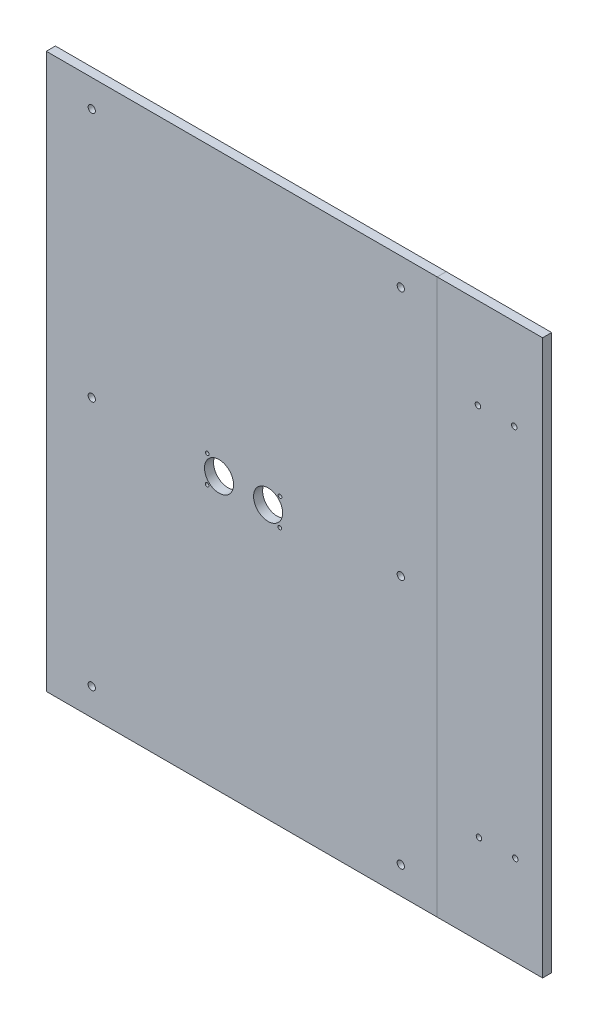
ISO-10303-21;
HEADER;
FILE_DESCRIPTION(('STEP AP214'),'2;1');
FILE_NAME('part.step','',(''),(''),'','','');
FILE_SCHEMA(('AUTOMOTIVE_DESIGN { 1 0 10303 214 1 1 1 1 }'));
ENDSEC;
DATA;
#1=APPLICATION_CONTEXT('core data for automotive mechanical design processes');
#2=APPLICATION_PROTOCOL_DEFINITION('international standard','automotive_design',2000,#1);
#3=PRODUCT_CONTEXT('',#1,'mechanical');
#4=PRODUCT('Part','Part','',(#3));
#5=PRODUCT_RELATED_PRODUCT_CATEGORY('part','',(#4));
#6=PRODUCT_DEFINITION_FORMATION('','',#4);
#7=PRODUCT_DEFINITION_CONTEXT('part definition',#1,'design');
#8=PRODUCT_DEFINITION('design','',#6,#7);
#9=PRODUCT_DEFINITION_SHAPE('','',#8);
#10=(LENGTH_UNIT() NAMED_UNIT(*) SI_UNIT(.MILLI.,.METRE.));
#11=(NAMED_UNIT(*) PLANE_ANGLE_UNIT() SI_UNIT($,.RADIAN.));
#12=(NAMED_UNIT(*) SI_UNIT($,.STERADIAN.) SOLID_ANGLE_UNIT());
#13=UNCERTAINTY_MEASURE_WITH_UNIT(LENGTH_MEASURE(1.E-05),#10,'distance_accuracy_value','');
#14=(GEOMETRIC_REPRESENTATION_CONTEXT(3) GLOBAL_UNCERTAINTY_ASSIGNED_CONTEXT((#13)) GLOBAL_UNIT_ASSIGNED_CONTEXT((#10,
#11,#12)) REPRESENTATION_CONTEXT('',''));
#15=CARTESIAN_POINT('',(0.,0.,0.));
#16=DIRECTION('',(0.,0.,1.));
#17=DIRECTION('',(1.,0.,0.));
#18=AXIS2_PLACEMENT_3D('',#15,#16,#17);
#19=CARTESIAN_POINT('',(215.,305.,5.));
#20=DIRECTION('',(-1.,0.,0.));
#21=DIRECTION('',(0.,0.,1.));
#22=AXIS2_PLACEMENT_3D('',#19,#20,#21);
#23=PLANE('',#22);
#24=DIRECTION('',(0.,1.,0.));
#25=VECTOR('',#24,1.);
#26=CARTESIAN_POINT('',(215.,305.,0.));
#27=LINE('',#26,#25);
#28=CARTESIAN_POINT('',(215.,0.,0.));
#29=VERTEX_POINT('',#28);
#30=CARTESIAN_POINT('',(215.,305.,0.));
#31=VERTEX_POINT('',#30);
#32=EDGE_CURVE('E108',#29,#31,#27,.T.);
#33=ORIENTED_EDGE('',*,*,#32,.F.);
#34=DIRECTION('',(0.,0.,-1.));
#35=VECTOR('',#34,1.);
#36=CARTESIAN_POINT('',(215.,0.,5.));
#37=LINE('',#36,#35);
#38=CARTESIAN_POINT('',(215.,0.,5.));
#39=VERTEX_POINT('',#38);
#40=EDGE_CURVE('E12',#39,#29,#37,.T.);
#41=ORIENTED_EDGE('',*,*,#40,.F.);
#42=DIRECTION('',(0.,1.,0.));
#43=VECTOR('',#42,1.);
#44=CARTESIAN_POINT('',(215.,305.,5.));
#45=LINE('',#44,#43);
#46=CARTESIAN_POINT('',(215.,305.,5.));
#47=VERTEX_POINT('',#46);
#48=EDGE_CURVE('E101',#39,#47,#45,.T.);
#49=ORIENTED_EDGE('',*,*,#48,.T.);
#50=DIRECTION('',(0.,0.,-1.));
#51=VECTOR('',#50,1.);
#52=CARTESIAN_POINT('',(215.,305.,5.));
#53=LINE('',#52,#51);
#54=EDGE_CURVE('E46',#47,#31,#53,.T.);
#55=ORIENTED_EDGE('',*,*,#54,.T.);
#56=EDGE_LOOP('',(#33,#41,#49,#55));
#57=FACE_BOUND('',#56,.T.);
#58=ADVANCED_FACE('F43',(#57),#23,.T.);
#59=CARTESIAN_POINT('',(215.,0.,5.));
#60=DIRECTION('',(0.,-1.,0.));
#61=DIRECTION('',(1.,0.,0.));
#62=AXIS2_PLACEMENT_3D('',#59,#60,#61);
#63=PLANE('',#62);
#64=DIRECTION('',(-1.,0.,0.));
#65=VECTOR('',#64,1.);
#66=CARTESIAN_POINT('',(215.,0.,0.));
#67=LINE('',#66,#65);
#68=CARTESIAN_POINT('',(273.,0.,0.));
#69=VERTEX_POINT('',#68);
#70=EDGE_CURVE('E103',#69,#29,#67,.T.);
#71=ORIENTED_EDGE('',*,*,#70,.F.);
#72=DIRECTION('',(0.,0.,-1.));
#73=VECTOR('',#72,1.);
#74=CARTESIAN_POINT('',(273.,0.,5.));
#75=LINE('',#74,#73);
#76=CARTESIAN_POINT('',(273.,0.,5.));
#77=VERTEX_POINT('',#76);
#78=EDGE_CURVE('E52',#77,#69,#75,.T.);
#79=ORIENTED_EDGE('',*,*,#78,.F.);
#80=DIRECTION('',(-1.,0.,0.));
#81=VECTOR('',#80,1.);
#82=CARTESIAN_POINT('',(215.,0.,5.));
#83=LINE('',#82,#81);
#84=EDGE_CURVE('E98',#77,#39,#83,.T.);
#85=ORIENTED_EDGE('',*,*,#84,.T.);
#86=ORIENTED_EDGE('',*,*,#40,.T.);
#87=EDGE_LOOP('',(#71,#79,#85,#86));
#88=FACE_BOUND('',#87,.T.);
#89=ADVANCED_FACE('F119',(#88),#63,.T.);
#90=CARTESIAN_POINT('',(273.,305.,5.));
#91=DIRECTION('',(1.,0.,0.));
#92=DIRECTION('',(0.,0.,-1.));
#93=AXIS2_PLACEMENT_3D('',#90,#91,#92);
#94=PLANE('',#93);
#95=DIRECTION('',(0.,-1.,0.));
#96=VECTOR('',#95,1.);
#97=CARTESIAN_POINT('',(273.,305.,0.));
#98=LINE('',#97,#96);
#99=CARTESIAN_POINT('',(273.,305.,0.));
#100=VERTEX_POINT('',#99);
#101=EDGE_CURVE('E93',#100,#69,#98,.T.);
#102=ORIENTED_EDGE('',*,*,#101,.F.);
#103=DIRECTION('',(0.,0.,-1.));
#104=VECTOR('',#103,1.);
#105=CARTESIAN_POINT('',(273.,305.,5.));
#106=LINE('',#105,#104);
#107=CARTESIAN_POINT('',(273.,305.,5.));
#108=VERTEX_POINT('',#107);
#109=EDGE_CURVE('E88',#108,#100,#106,.T.);
#110=ORIENTED_EDGE('',*,*,#109,.F.);
#111=DIRECTION('',(0.,-1.,0.));
#112=VECTOR('',#111,1.);
#113=CARTESIAN_POINT('',(273.,305.,5.));
#114=LINE('',#113,#112);
#115=EDGE_CURVE('E91',#108,#77,#114,.T.);
#116=ORIENTED_EDGE('',*,*,#115,.T.);
#117=ORIENTED_EDGE('',*,*,#78,.T.);
#118=EDGE_LOOP('',(#102,#110,#116,#117));
#119=FACE_BOUND('',#118,.T.);
#120=ADVANCED_FACE('F90',(#119),#94,.T.);
#121=CARTESIAN_POINT('',(215.,305.,5.));
#122=DIRECTION('',(0.,1.,0.));
#123=DIRECTION('',(0.,0.,1.));
#124=AXIS2_PLACEMENT_3D('',#121,#122,#123);
#125=PLANE('',#124);
#126=DIRECTION('',(1.,0.,0.));
#127=VECTOR('',#126,1.);
#128=CARTESIAN_POINT('',(215.,305.,0.));
#129=LINE('',#128,#127);
#130=EDGE_CURVE('E111',#31,#100,#129,.T.);
#131=ORIENTED_EDGE('',*,*,#130,.F.);
#132=ORIENTED_EDGE('',*,*,#54,.F.);
#133=DIRECTION('',(1.,0.,0.));
#134=VECTOR('',#133,1.);
#135=CARTESIAN_POINT('',(215.,305.,5.));
#136=LINE('',#135,#134);
#137=EDGE_CURVE('E97',#47,#108,#136,.T.);
#138=ORIENTED_EDGE('',*,*,#137,.T.);
#139=ORIENTED_EDGE('',*,*,#109,.T.);
#140=EDGE_LOOP('',(#131,#132,#138,#139));
#141=FACE_BOUND('',#140,.T.);
#142=ADVANCED_FACE('F100',(#141),#125,.T.);
#143=CARTESIAN_POINT('',(0.,0.,5.));
#144=DIRECTION('',(0.,0.,1.));
#145=DIRECTION('',(1.,0.,0.));
#146=AXIS2_PLACEMENT_3D('',#143,#144,#145);
#147=PLANE('',#146);
#148=CARTESIAN_POINT('',(258.,49.4999999999997,5.));
#149=DIRECTION('',(0.,0.,1.));
#150=DIRECTION('',(1.,0.,0.));
#151=AXIS2_PLACEMENT_3D('',#148,#149,#150);
#152=CIRCLE('',#151,1.50000000000002);
#153=CARTESIAN_POINT('',(259.5,49.4999999999997,5.));
#154=VERTEX_POINT('',#153);
#155=EDGE_CURVE('E163',#154,#154,#152,.T.);
#156=ORIENTED_EDGE('',*,*,#155,.F.);
#157=EDGE_LOOP('',(#156));
#158=FACE_BOUND('',#157,.T.);
#159=CARTESIAN_POINT('',(238.,49.4999999999997,5.));
#160=DIRECTION('',(0.,0.,1.));
#161=DIRECTION('',(1.,0.,0.));
#162=AXIS2_PLACEMENT_3D('',#159,#160,#161);
#163=CIRCLE('',#162,1.50000000000003);
#164=CARTESIAN_POINT('',(239.5,49.4999999999997,5.));
#165=VERTEX_POINT('',#164);
#166=EDGE_CURVE('E165',#165,#165,#163,.T.);
#167=ORIENTED_EDGE('',*,*,#166,.F.);
#168=EDGE_LOOP('',(#167));
#169=FACE_BOUND('',#168,.T.);
#170=CARTESIAN_POINT('',(257.4,255.,5.));
#171=DIRECTION('',(0.,0.,-1.));
#172=DIRECTION('',(-1.,0.,0.));
#173=AXIS2_PLACEMENT_3D('',#170,#171,#172);
#174=CIRCLE('',#173,1.50000000000002);
#175=CARTESIAN_POINT('',(255.9,255.,5.));
#176=VERTEX_POINT('',#175);
#177=EDGE_CURVE('E174',#176,#176,#174,.T.);
#178=ORIENTED_EDGE('',*,*,#177,.T.);
#179=EDGE_LOOP('',(#178));
#180=FACE_BOUND('',#179,.T.);
#181=CARTESIAN_POINT('',(237.4,255.,5.));
#182=DIRECTION('',(0.,0.,-1.));
#183=DIRECTION('',(-1.,0.,0.));
#184=AXIS2_PLACEMENT_3D('',#181,#182,#183);
#185=CIRCLE('',#184,1.50000000000002);
#186=CARTESIAN_POINT('',(235.9,255.,5.));
#187=VERTEX_POINT('',#186);
#188=EDGE_CURVE('E112',#187,#187,#185,.T.);
#189=ORIENTED_EDGE('',*,*,#188,.T.);
#190=EDGE_LOOP('',(#189));
#191=FACE_BOUND('',#190,.T.);
#192=ORIENTED_EDGE('',*,*,#48,.F.);
#193=ORIENTED_EDGE('',*,*,#84,.F.);
#194=ORIENTED_EDGE('',*,*,#115,.F.);
#195=ORIENTED_EDGE('',*,*,#137,.F.);
#196=EDGE_LOOP('',(#192,#193,#194,#195));
#197=FACE_BOUND('',#196,.T.);
#198=ADVANCED_FACE('F96',(#158,#169,#180,#191,#197),#147,.T.);
#199=CARTESIAN_POINT('',(0.,0.,0.));
#200=DIRECTION('',(0.,0.,1.));
#201=DIRECTION('',(1.,0.,0.));
#202=AXIS2_PLACEMENT_3D('',#199,#200,#201);
#203=PLANE('',#202);
#204=CARTESIAN_POINT('',(258.,49.4999999999997,0.));
#205=DIRECTION('',(0.,0.,1.));
#206=DIRECTION('',(1.,0.,0.));
#207=AXIS2_PLACEMENT_3D('',#204,#205,#206);
#208=CIRCLE('',#207,1.50000000000002);
#209=CARTESIAN_POINT('',(259.5,49.4999999999997,0.));
#210=VERTEX_POINT('',#209);
#211=EDGE_CURVE('E161',#210,#210,#208,.T.);
#212=ORIENTED_EDGE('',*,*,#211,.T.);
#213=EDGE_LOOP('',(#212));
#214=FACE_BOUND('',#213,.T.);
#215=CARTESIAN_POINT('',(238.,49.4999999999997,0.));
#216=DIRECTION('',(0.,0.,1.));
#217=DIRECTION('',(1.,0.,0.));
#218=AXIS2_PLACEMENT_3D('',#215,#216,#217);
#219=CIRCLE('',#218,1.50000000000003);
#220=CARTESIAN_POINT('',(239.5,49.4999999999997,0.));
#221=VERTEX_POINT('',#220);
#222=EDGE_CURVE('E168',#221,#221,#219,.T.);
#223=ORIENTED_EDGE('',*,*,#222,.T.);
#224=EDGE_LOOP('',(#223));
#225=FACE_BOUND('',#224,.T.);
#226=CARTESIAN_POINT('',(257.4,255.,0.));
#227=DIRECTION('',(0.,0.,-1.));
#228=DIRECTION('',(-1.,0.,0.));
#229=AXIS2_PLACEMENT_3D('',#226,#227,#228);
#230=CIRCLE('',#229,1.50000000000002);
#231=CARTESIAN_POINT('',(255.9,255.,0.));
#232=VERTEX_POINT('',#231);
#233=EDGE_CURVE('E171',#232,#232,#230,.T.);
#234=ORIENTED_EDGE('',*,*,#233,.F.);
#235=EDGE_LOOP('',(#234));
#236=FACE_BOUND('',#235,.T.);
#237=CARTESIAN_POINT('',(237.4,255.,0.));
#238=DIRECTION('',(0.,0.,-1.));
#239=DIRECTION('',(-1.,0.,0.));
#240=AXIS2_PLACEMENT_3D('',#237,#238,#239);
#241=CIRCLE('',#240,1.50000000000002);
#242=CARTESIAN_POINT('',(235.9,255.,0.));
#243=VERTEX_POINT('',#242);
#244=EDGE_CURVE('E177',#243,#243,#241,.T.);
#245=ORIENTED_EDGE('',*,*,#244,.F.);
#246=EDGE_LOOP('',(#245));
#247=FACE_BOUND('',#246,.T.);
#248=ORIENTED_EDGE('',*,*,#32,.T.);
#249=ORIENTED_EDGE('',*,*,#130,.T.);
#250=ORIENTED_EDGE('',*,*,#101,.T.);
#251=ORIENTED_EDGE('',*,*,#70,.T.);
#252=EDGE_LOOP('',(#248,#249,#250,#251));
#253=FACE_BOUND('',#252,.T.);
#254=ADVANCED_FACE('F118',(#214,#225,#236,#247,#253),#203,.F.);
#255=CARTESIAN_POINT('',(237.4,255.,5.));
#256=DIRECTION('',(0.,0.,-1.));
#257=DIRECTION('',(-1.,0.,0.));
#258=AXIS2_PLACEMENT_3D('',#255,#256,#257);
#259=CYLINDRICAL_SURFACE('',#258,1.50000000000002);
#260=ORIENTED_EDGE('',*,*,#188,.F.);
#261=EDGE_LOOP('',(#260));
#262=FACE_BOUND('',#261,.T.);
#263=ORIENTED_EDGE('',*,*,#244,.T.);
#264=EDGE_LOOP('',(#263));
#265=FACE_BOUND('',#264,.T.);
#266=ADVANCED_FACE('F137',(#262,#265),#259,.F.);
#267=CARTESIAN_POINT('',(257.4,255.,5.));
#268=DIRECTION('',(0.,0.,-1.));
#269=DIRECTION('',(-1.,0.,0.));
#270=AXIS2_PLACEMENT_3D('',#267,#268,#269);
#271=CYLINDRICAL_SURFACE('',#270,1.50000000000002);
#272=ORIENTED_EDGE('',*,*,#177,.F.);
#273=EDGE_LOOP('',(#272));
#274=FACE_BOUND('',#273,.T.);
#275=ORIENTED_EDGE('',*,*,#233,.T.);
#276=EDGE_LOOP('',(#275));
#277=FACE_BOUND('',#276,.T.);
#278=ADVANCED_FACE('F144',(#274,#277),#271,.F.);
#279=CARTESIAN_POINT('',(238.,49.4999999999997,0.));
#280=DIRECTION('',(0.,0.,1.));
#281=DIRECTION('',(1.,0.,0.));
#282=AXIS2_PLACEMENT_3D('',#279,#280,#281);
#283=CYLINDRICAL_SURFACE('',#282,1.50000000000003);
#284=ORIENTED_EDGE('',*,*,#222,.F.);
#285=EDGE_LOOP('',(#284));
#286=FACE_BOUND('',#285,.T.);
#287=ORIENTED_EDGE('',*,*,#166,.T.);
#288=EDGE_LOOP('',(#287));
#289=FACE_BOUND('',#288,.T.);
#290=ADVANCED_FACE('F148',(#286,#289),#283,.F.);
#291=CARTESIAN_POINT('',(258.,49.4999999999997,0.));
#292=DIRECTION('',(0.,0.,1.));
#293=DIRECTION('',(1.,0.,0.));
#294=AXIS2_PLACEMENT_3D('',#291,#292,#293);
#295=CYLINDRICAL_SURFACE('',#294,1.50000000000002);
#296=ORIENTED_EDGE('',*,*,#211,.F.);
#297=EDGE_LOOP('',(#296));
#298=FACE_BOUND('',#297,.T.);
#299=ORIENTED_EDGE('',*,*,#155,.T.);
#300=EDGE_LOOP('',(#299));
#301=FACE_BOUND('',#300,.T.);
#302=ADVANCED_FACE('F152',(#298,#301),#295,.F.);
#303=CLOSED_SHELL('',(#58,#89,#120,#142,#198,#254,#266,#278,#290,#302));
#304=MANIFOLD_SOLID_BREP('B2',#303);
#305=CARTESIAN_POINT('',(0.,0.,5.));
#306=DIRECTION('',(1.,0.,0.));
#307=DIRECTION('',(0.,0.,-1.));
#308=AXIS2_PLACEMENT_3D('',#305,#306,#307);
#309=PLANE('',#308);
#310=DIRECTION('',(0.,-1.,0.));
#311=VECTOR('',#310,1.);
#312=CARTESIAN_POINT('',(0.,0.,0.));
#313=LINE('',#312,#311);
#314=CARTESIAN_POINT('',(0.,305.,0.));
#315=VERTEX_POINT('',#314);
#316=CARTESIAN_POINT('',(0.,0.,0.));
#317=VERTEX_POINT('',#316);
#318=EDGE_CURVE('E314',#315,#317,#313,.T.);
#319=ORIENTED_EDGE('',*,*,#318,.T.);
#320=DIRECTION('',(0.,0.,-1.));
#321=VECTOR('',#320,1.);
#322=CARTESIAN_POINT('',(0.,0.,5.));
#323=LINE('',#322,#321);
#324=CARTESIAN_POINT('',(0.,0.,5.));
#325=VERTEX_POINT('',#324);
#326=EDGE_CURVE('E41',#325,#317,#323,.T.);
#327=ORIENTED_EDGE('',*,*,#326,.F.);
#328=DIRECTION('',(0.,-1.,0.));
#329=VECTOR('',#328,1.);
#330=CARTESIAN_POINT('',(0.,0.,5.));
#331=LINE('',#330,#329);
#332=CARTESIAN_POINT('',(0.,305.,5.));
#333=VERTEX_POINT('',#332);
#334=EDGE_CURVE('E302',#333,#325,#331,.T.);
#335=ORIENTED_EDGE('',*,*,#334,.F.);
#336=DIRECTION('',(0.,0.,-1.));
#337=VECTOR('',#336,1.);
#338=CARTESIAN_POINT('',(0.,305.,5.));
#339=LINE('',#338,#337);
#340=EDGE_CURVE('E310',#333,#315,#339,.T.);
#341=ORIENTED_EDGE('',*,*,#340,.T.);
#342=EDGE_LOOP('',(#319,#327,#335,#341));
#343=FACE_BOUND('',#342,.T.);
#344=ADVANCED_FACE('F251',(#343),#309,.F.);
#345=CARTESIAN_POINT('',(0.,0.,5.));
#346=DIRECTION('',(0.,1.,0.));
#347=DIRECTION('',(0.,0.,1.));
#348=AXIS2_PLACEMENT_3D('',#345,#346,#347);
#349=PLANE('',#348);
#350=DIRECTION('',(1.,0.,0.));
#351=VECTOR('',#350,1.);
#352=CARTESIAN_POINT('',(0.,0.,0.));
#353=LINE('',#352,#351);
#354=CARTESIAN_POINT('',(215.,0.,0.));
#355=VERTEX_POINT('',#354);
#356=EDGE_CURVE('E306',#317,#355,#353,.T.);
#357=ORIENTED_EDGE('',*,*,#356,.T.);
#358=DIRECTION('',(0.,0.,-1.));
#359=VECTOR('',#358,1.);
#360=CARTESIAN_POINT('',(215.,0.,5.));
#361=LINE('',#360,#359);
#362=CARTESIAN_POINT('',(215.,0.,5.));
#363=VERTEX_POINT('',#362);
#364=EDGE_CURVE('E259',#363,#355,#361,.T.);
#365=ORIENTED_EDGE('',*,*,#364,.F.);
#366=DIRECTION('',(1.,0.,0.));
#367=VECTOR('',#366,1.);
#368=CARTESIAN_POINT('',(0.,0.,5.));
#369=LINE('',#368,#367);
#370=EDGE_CURVE('E297',#325,#363,#369,.T.);
#371=ORIENTED_EDGE('',*,*,#370,.F.);
#372=ORIENTED_EDGE('',*,*,#326,.T.);
#373=EDGE_LOOP('',(#357,#365,#371,#372));
#374=FACE_BOUND('',#373,.T.);
#375=ADVANCED_FACE('F305',(#374),#349,.F.);
#376=CARTESIAN_POINT('',(215.,0.,5.));
#377=DIRECTION('',(-1.,0.,0.));
#378=DIRECTION('',(0.,0.,1.));
#379=AXIS2_PLACEMENT_3D('',#376,#377,#378);
#380=PLANE('',#379);
#381=DIRECTION('',(0.,1.,0.));
#382=VECTOR('',#381,1.);
#383=CARTESIAN_POINT('',(215.,0.,0.));
#384=LINE('',#383,#382);
#385=CARTESIAN_POINT('',(215.,305.,0.));
#386=VERTEX_POINT('',#385);
#387=EDGE_CURVE('E284',#355,#386,#384,.T.);
#388=ORIENTED_EDGE('',*,*,#387,.T.);
#389=DIRECTION('',(0.,0.,-1.));
#390=VECTOR('',#389,1.);
#391=CARTESIAN_POINT('',(215.,305.,5.));
#392=LINE('',#391,#390);
#393=CARTESIAN_POINT('',(215.,305.,5.));
#394=VERTEX_POINT('',#393);
#395=EDGE_CURVE('E307',#394,#386,#392,.T.);
#396=ORIENTED_EDGE('',*,*,#395,.F.);
#397=DIRECTION('',(0.,1.,0.));
#398=VECTOR('',#397,1.);
#399=CARTESIAN_POINT('',(215.,0.,5.));
#400=LINE('',#399,#398);
#401=EDGE_CURVE('E300',#363,#394,#400,.T.);
#402=ORIENTED_EDGE('',*,*,#401,.F.);
#403=ORIENTED_EDGE('',*,*,#364,.T.);
#404=EDGE_LOOP('',(#388,#396,#402,#403));
#405=FACE_BOUND('',#404,.T.);
#406=ADVANCED_FACE('F308',(#405),#380,.F.);
#407=CARTESIAN_POINT('',(0.,305.,5.));
#408=DIRECTION('',(0.,-1.,0.));
#409=DIRECTION('',(0.,0.,-1.));
#410=AXIS2_PLACEMENT_3D('',#407,#408,#409);
#411=PLANE('',#410);
#412=DIRECTION('',(-1.,0.,0.));
#413=VECTOR('',#412,1.);
#414=CARTESIAN_POINT('',(0.,305.,0.));
#415=LINE('',#414,#413);
#416=EDGE_CURVE('E290',#386,#315,#415,.T.);
#417=ORIENTED_EDGE('',*,*,#416,.T.);
#418=ORIENTED_EDGE('',*,*,#340,.F.);
#419=DIRECTION('',(-1.,0.,0.));
#420=VECTOR('',#419,1.);
#421=CARTESIAN_POINT('',(0.,305.,5.));
#422=LINE('',#421,#420);
#423=EDGE_CURVE('E267',#394,#333,#422,.T.);
#424=ORIENTED_EDGE('',*,*,#423,.F.);
#425=ORIENTED_EDGE('',*,*,#395,.T.);
#426=EDGE_LOOP('',(#417,#418,#424,#425));
#427=FACE_BOUND('',#426,.T.);
#428=ADVANCED_FACE('F322',(#427),#411,.F.);
#429=CARTESIAN_POINT('',(0.,0.,5.));
#430=DIRECTION('',(0.,0.,-1.));
#431=DIRECTION('',(-1.,0.,0.));
#432=AXIS2_PLACEMENT_3D('',#429,#430,#431);
#433=PLANE('',#432);
#434=CARTESIAN_POINT('',(128.451980771845,142.285475877277,5.));
#435=DIRECTION('',(0.,0.,-1.));
#436=DIRECTION('',(-1.,0.,0.));
#437=AXIS2_PLACEMENT_3D('',#434,#435,#436);
#438=CIRCLE('',#437,0.999999999999998);
#439=CARTESIAN_POINT('',(127.451980771845,142.285475877277,5.));
#440=VERTEX_POINT('',#439);
#441=EDGE_CURVE('E379',#440,#440,#438,.T.);
#442=ORIENTED_EDGE('',*,*,#441,.T.);
#443=EDGE_LOOP('',(#442));
#444=FACE_BOUND('',#443,.T.);
#445=CARTESIAN_POINT('',(88.5480363246736,157.714598256853,5.));
#446=DIRECTION('',(0.,0.,-1.));
#447=DIRECTION('',(-1.,0.,0.));
#448=AXIS2_PLACEMENT_3D('',#445,#446,#447);
#449=CIRCLE('',#448,0.999999999999998);
#450=CARTESIAN_POINT('',(87.5480363246736,157.714598256853,5.));
#451=VERTEX_POINT('',#450);
#452=EDGE_CURVE('E391',#451,#451,#449,.T.);
#453=ORIENTED_EDGE('',*,*,#452,.T.);
#454=EDGE_LOOP('',(#453));
#455=FACE_BOUND('',#454,.T.);
#456=CARTESIAN_POINT('',(88.4519475760372,142.714598256853,5.));
#457=DIRECTION('',(0.,0.,-1.));
#458=DIRECTION('',(-1.,0.,0.));
#459=AXIS2_PLACEMENT_3D('',#456,#457,#458);
#460=CIRCLE('',#459,0.999999999999998);
#461=CARTESIAN_POINT('',(87.4519475760372,142.714598256853,5.));
#462=VERTEX_POINT('',#461);
#463=EDGE_CURVE('E385',#462,#462,#460,.T.);
#464=ORIENTED_EDGE('',*,*,#463,.T.);
#465=EDGE_LOOP('',(#464));
#466=FACE_BOUND('',#465,.T.);
#467=CARTESIAN_POINT('',(128.548036324674,157.285475877277,5.));
#468=DIRECTION('',(0.,0.,-1.));
#469=DIRECTION('',(-1.,0.,0.));
#470=AXIS2_PLACEMENT_3D('',#467,#468,#469);
#471=CIRCLE('',#470,0.999999999999998);
#472=CARTESIAN_POINT('',(127.548036324674,157.285475877277,5.));
#473=VERTEX_POINT('',#472);
#474=EDGE_CURVE('E373',#473,#473,#471,.T.);
#475=ORIENTED_EDGE('',*,*,#474,.T.);
#476=EDGE_LOOP('',(#475));
#477=FACE_BOUND('',#476,.T.);
#478=CARTESIAN_POINT('',(95.,150.,5.));
#479=DIRECTION('',(0.,0.,-1.));
#480=DIRECTION('',(-1.,0.,0.));
#481=AXIS2_PLACEMENT_3D('',#478,#479,#480);
#482=CIRCLE('',#481,8.00000000000003);
#483=CARTESIAN_POINT('',(87.,150.,5.));
#484=VERTEX_POINT('',#483);
#485=EDGE_CURVE('E367',#484,#484,#482,.T.);
#486=ORIENTED_EDGE('',*,*,#485,.T.);
#487=EDGE_LOOP('',(#486));
#488=FACE_BOUND('',#487,.T.);
#489=CARTESIAN_POINT('',(122.,150.,5.));
#490=DIRECTION('',(0.,0.,-1.));
#491=DIRECTION('',(-1.,0.,0.));
#492=AXIS2_PLACEMENT_3D('',#489,#490,#491);
#493=CIRCLE('',#492,8.00000000000003);
#494=CARTESIAN_POINT('',(114.,150.,5.));
#495=VERTEX_POINT('',#494);
#496=EDGE_CURVE('E350',#495,#495,#493,.T.);
#497=ORIENTED_EDGE('',*,*,#496,.T.);
#498=EDGE_LOOP('',(#497));
#499=FACE_BOUND('',#498,.T.);
#500=CARTESIAN_POINT('',(25.,152.5,5.));
#501=DIRECTION('',(0.,0.,-1.));
#502=DIRECTION('',(-1.,0.,0.));
#503=AXIS2_PLACEMENT_3D('',#500,#501,#502);
#504=CIRCLE('',#503,2.);
#505=CARTESIAN_POINT('',(23.,152.5,5.));
#506=VERTEX_POINT('',#505);
#507=EDGE_CURVE('E349',#506,#506,#504,.T.);
#508=ORIENTED_EDGE('',*,*,#507,.T.);
#509=EDGE_LOOP('',(#508));
#510=FACE_BOUND('',#509,.T.);
#511=CARTESIAN_POINT('',(195.,152.5,5.));
#512=DIRECTION('',(0.,0.,-1.));
#513=DIRECTION('',(-1.,0.,0.));
#514=AXIS2_PLACEMENT_3D('',#511,#512,#513);
#515=CIRCLE('',#514,2.);
#516=CARTESIAN_POINT('',(193.,152.5,5.));
#517=VERTEX_POINT('',#516);
#518=EDGE_CURVE('E356',#517,#517,#515,.T.);
#519=ORIENTED_EDGE('',*,*,#518,.T.);
#520=EDGE_LOOP('',(#519));
#521=FACE_BOUND('',#520,.T.);
#522=CARTESIAN_POINT('',(195.,15.,5.));
#523=DIRECTION('',(0.,0.,-1.));
#524=DIRECTION('',(-1.,0.,0.));
#525=AXIS2_PLACEMENT_3D('',#522,#523,#524);
#526=CIRCLE('',#525,2.);
#527=CARTESIAN_POINT('',(193.,15.,5.));
#528=VERTEX_POINT('',#527);
#529=EDGE_CURVE('E338',#528,#528,#526,.T.);
#530=ORIENTED_EDGE('',*,*,#529,.T.);
#531=EDGE_LOOP('',(#530));
#532=FACE_BOUND('',#531,.T.);
#533=CARTESIAN_POINT('',(25.,15.,5.));
#534=DIRECTION('',(0.,0.,-1.));
#535=DIRECTION('',(-1.,0.,0.));
#536=AXIS2_PLACEMENT_3D('',#533,#534,#535);
#537=CIRCLE('',#536,2.);
#538=CARTESIAN_POINT('',(23.,15.,5.));
#539=VERTEX_POINT('',#538);
#540=EDGE_CURVE('E337',#539,#539,#537,.T.);
#541=ORIENTED_EDGE('',*,*,#540,.T.);
#542=EDGE_LOOP('',(#541));
#543=FACE_BOUND('',#542,.T.);
#544=CARTESIAN_POINT('',(25.,290.,5.));
#545=DIRECTION('',(0.,0.,-1.));
#546=DIRECTION('',(-1.,0.,0.));
#547=AXIS2_PLACEMENT_3D('',#544,#545,#546);
#548=CIRCLE('',#547,2.00000000000001);
#549=CARTESIAN_POINT('',(23.,290.,5.));
#550=VERTEX_POINT('',#549);
#551=EDGE_CURVE('E331',#550,#550,#548,.T.);
#552=ORIENTED_EDGE('',*,*,#551,.T.);
#553=EDGE_LOOP('',(#552));
#554=FACE_BOUND('',#553,.T.);
#555=CARTESIAN_POINT('',(195.,290.,5.));
#556=DIRECTION('',(0.,0.,-1.));
#557=DIRECTION('',(-1.,0.,0.));
#558=AXIS2_PLACEMENT_3D('',#555,#556,#557);
#559=CIRCLE('',#558,2.);
#560=CARTESIAN_POINT('',(193.,290.,5.));
#561=VERTEX_POINT('',#560);
#562=EDGE_CURVE('E317',#561,#561,#559,.T.);
#563=ORIENTED_EDGE('',*,*,#562,.T.);
#564=EDGE_LOOP('',(#563));
#565=FACE_BOUND('',#564,.T.);
#566=ORIENTED_EDGE('',*,*,#334,.T.);
#567=ORIENTED_EDGE('',*,*,#370,.T.);
#568=ORIENTED_EDGE('',*,*,#401,.T.);
#569=ORIENTED_EDGE('',*,*,#423,.T.);
#570=EDGE_LOOP('',(#566,#567,#568,#569));
#571=FACE_BOUND('',#570,.T.);
#572=ADVANCED_FACE('F298',(#444,#455,#466,#477,#488,#499,#510,#521,#532,#543,#554,#565,#571),
#433,.F.);
#573=CARTESIAN_POINT('',(0.,0.,0.));
#574=DIRECTION('',(0.,0.,-1.));
#575=DIRECTION('',(-1.,0.,0.));
#576=AXIS2_PLACEMENT_3D('',#573,#574,#575);
#577=PLANE('',#576);
#578=CARTESIAN_POINT('',(128.451980771845,142.285475877277,0.));
#579=DIRECTION('',(0.,0.,-1.));
#580=DIRECTION('',(-1.,0.,0.));
#581=AXIS2_PLACEMENT_3D('',#578,#579,#580);
#582=CIRCLE('',#581,0.999999999999998);
#583=CARTESIAN_POINT('',(127.451980771845,142.285475877277,0.));
#584=VERTEX_POINT('',#583);
#585=EDGE_CURVE('E394',#584,#584,#582,.T.);
#586=ORIENTED_EDGE('',*,*,#585,.F.);
#587=EDGE_LOOP('',(#586));
#588=FACE_BOUND('',#587,.T.);
#589=CARTESIAN_POINT('',(88.5480363246736,157.714598256853,0.));
#590=DIRECTION('',(0.,0.,-1.));
#591=DIRECTION('',(-1.,0.,0.));
#592=AXIS2_PLACEMENT_3D('',#589,#590,#591);
#593=CIRCLE('',#592,0.999999999999998);
#594=CARTESIAN_POINT('',(87.5480363246736,157.714598256853,0.));
#595=VERTEX_POINT('',#594);
#596=EDGE_CURVE('E388',#595,#595,#593,.T.);
#597=ORIENTED_EDGE('',*,*,#596,.F.);
#598=EDGE_LOOP('',(#597));
#599=FACE_BOUND('',#598,.T.);
#600=CARTESIAN_POINT('',(88.4519475760372,142.714598256853,0.));
#601=DIRECTION('',(0.,0.,-1.));
#602=DIRECTION('',(-1.,0.,0.));
#603=AXIS2_PLACEMENT_3D('',#600,#601,#602);
#604=CIRCLE('',#603,0.999999999999998);
#605=CARTESIAN_POINT('',(87.4519475760372,142.714598256853,0.));
#606=VERTEX_POINT('',#605);
#607=EDGE_CURVE('E382',#606,#606,#604,.T.);
#608=ORIENTED_EDGE('',*,*,#607,.F.);
#609=EDGE_LOOP('',(#608));
#610=FACE_BOUND('',#609,.T.);
#611=CARTESIAN_POINT('',(128.548036324674,157.285475877277,0.));
#612=DIRECTION('',(0.,0.,-1.));
#613=DIRECTION('',(-1.,0.,0.));
#614=AXIS2_PLACEMENT_3D('',#611,#612,#613);
#615=CIRCLE('',#614,0.999999999999998);
#616=CARTESIAN_POINT('',(127.548036324674,157.285475877277,0.));
#617=VERTEX_POINT('',#616);
#618=EDGE_CURVE('E376',#617,#617,#615,.T.);
#619=ORIENTED_EDGE('',*,*,#618,.F.);
#620=EDGE_LOOP('',(#619));
#621=FACE_BOUND('',#620,.T.);
#622=CARTESIAN_POINT('',(95.,150.,0.));
#623=DIRECTION('',(0.,0.,-1.));
#624=DIRECTION('',(-1.,0.,0.));
#625=AXIS2_PLACEMENT_3D('',#622,#623,#624);
#626=CIRCLE('',#625,8.00000000000003);
#627=CARTESIAN_POINT('',(87.,150.,0.));
#628=VERTEX_POINT('',#627);
#629=EDGE_CURVE('E370',#628,#628,#626,.T.);
#630=ORIENTED_EDGE('',*,*,#629,.F.);
#631=EDGE_LOOP('',(#630));
#632=FACE_BOUND('',#631,.T.);
#633=CARTESIAN_POINT('',(122.,150.,0.));
#634=DIRECTION('',(0.,0.,-1.));
#635=DIRECTION('',(-1.,0.,0.));
#636=AXIS2_PLACEMENT_3D('',#633,#634,#635);
#637=CIRCLE('',#636,8.00000000000003);
#638=CARTESIAN_POINT('',(114.,150.,0.));
#639=VERTEX_POINT('',#638);
#640=EDGE_CURVE('E364',#639,#639,#637,.T.);
#641=ORIENTED_EDGE('',*,*,#640,.F.);
#642=EDGE_LOOP('',(#641));
#643=FACE_BOUND('',#642,.T.);
#644=CARTESIAN_POINT('',(25.,152.5,0.));
#645=DIRECTION('',(0.,0.,-1.));
#646=DIRECTION('',(-1.,0.,0.));
#647=AXIS2_PLACEMENT_3D('',#644,#645,#646);
#648=CIRCLE('',#647,2.);
#649=CARTESIAN_POINT('',(23.,152.5,0.));
#650=VERTEX_POINT('',#649);
#651=EDGE_CURVE('E346',#650,#650,#648,.T.);
#652=ORIENTED_EDGE('',*,*,#651,.F.);
#653=EDGE_LOOP('',(#652));
#654=FACE_BOUND('',#653,.T.);
#655=CARTESIAN_POINT('',(195.,152.5,0.));
#656=DIRECTION('',(0.,0.,-1.));
#657=DIRECTION('',(-1.,0.,0.));
#658=AXIS2_PLACEMENT_3D('',#655,#656,#657);
#659=CIRCLE('',#658,2.);
#660=CARTESIAN_POINT('',(193.,152.5,0.));
#661=VERTEX_POINT('',#660);
#662=EDGE_CURVE('E353',#661,#661,#659,.T.);
#663=ORIENTED_EDGE('',*,*,#662,.F.);
#664=EDGE_LOOP('',(#663));
#665=FACE_BOUND('',#664,.T.);
#666=CARTESIAN_POINT('',(195.,15.,0.));
#667=DIRECTION('',(0.,0.,-1.));
#668=DIRECTION('',(-1.,0.,0.));
#669=AXIS2_PLACEMENT_3D('',#666,#667,#668);
#670=CIRCLE('',#669,2.);
#671=CARTESIAN_POINT('',(193.,15.,0.));
#672=VERTEX_POINT('',#671);
#673=EDGE_CURVE('E359',#672,#672,#670,.T.);
#674=ORIENTED_EDGE('',*,*,#673,.F.);
#675=EDGE_LOOP('',(#674));
#676=FACE_BOUND('',#675,.T.);
#677=CARTESIAN_POINT('',(25.,15.,0.));
#678=DIRECTION('',(0.,0.,-1.));
#679=DIRECTION('',(-1.,0.,0.));
#680=AXIS2_PLACEMENT_3D('',#677,#678,#679);
#681=CIRCLE('',#680,2.);
#682=CARTESIAN_POINT('',(23.,15.,0.));
#683=VERTEX_POINT('',#682);
#684=EDGE_CURVE('E334',#683,#683,#681,.T.);
#685=ORIENTED_EDGE('',*,*,#684,.F.);
#686=EDGE_LOOP('',(#685));
#687=FACE_BOUND('',#686,.T.);
#688=CARTESIAN_POINT('',(25.,290.,0.));
#689=DIRECTION('',(0.,0.,-1.));
#690=DIRECTION('',(-1.,0.,0.));
#691=AXIS2_PLACEMENT_3D('',#688,#689,#690);
#692=CIRCLE('',#691,2.00000000000001);
#693=CARTESIAN_POINT('',(23.,290.,0.));
#694=VERTEX_POINT('',#693);
#695=EDGE_CURVE('E341',#694,#694,#692,.T.);
#696=ORIENTED_EDGE('',*,*,#695,.F.);
#697=EDGE_LOOP('',(#696));
#698=FACE_BOUND('',#697,.T.);
#699=CARTESIAN_POINT('',(195.,290.,0.));
#700=DIRECTION('',(0.,0.,-1.));
#701=DIRECTION('',(-1.,0.,0.));
#702=AXIS2_PLACEMENT_3D('',#699,#700,#701);
#703=CIRCLE('',#702,2.);
#704=CARTESIAN_POINT('',(193.,290.,0.));
#705=VERTEX_POINT('',#704);
#706=EDGE_CURVE('E328',#705,#705,#703,.T.);
#707=ORIENTED_EDGE('',*,*,#706,.F.);
#708=EDGE_LOOP('',(#707));
#709=FACE_BOUND('',#708,.T.);
#710=ORIENTED_EDGE('',*,*,#318,.F.);
#711=ORIENTED_EDGE('',*,*,#416,.F.);
#712=ORIENTED_EDGE('',*,*,#387,.F.);
#713=ORIENTED_EDGE('',*,*,#356,.F.);
#714=EDGE_LOOP('',(#710,#711,#712,#713));
#715=FACE_BOUND('',#714,.T.);
#716=ADVANCED_FACE('F325',(#588,#599,#610,#621,#632,#643,#654,#665,#676,#687,#698,#709,#715),
#577,.T.);
#717=CARTESIAN_POINT('',(195.,290.,5.));
#718=DIRECTION('',(0.,0.,-1.));
#719=DIRECTION('',(-1.,0.,0.));
#720=AXIS2_PLACEMENT_3D('',#717,#718,#719);
#721=CYLINDRICAL_SURFACE('',#720,2.);
#722=ORIENTED_EDGE('',*,*,#562,.F.);
#723=EDGE_LOOP('',(#722));
#724=FACE_BOUND('',#723,.T.);
#725=ORIENTED_EDGE('',*,*,#706,.T.);
#726=EDGE_LOOP('',(#725));
#727=FACE_BOUND('',#726,.T.);
#728=ADVANCED_FACE('F411',(#724,#727),#721,.F.);
#729=CARTESIAN_POINT('',(25.,290.,5.));
#730=DIRECTION('',(0.,0.,-1.));
#731=DIRECTION('',(-1.,0.,0.));
#732=AXIS2_PLACEMENT_3D('',#729,#730,#731);
#733=CYLINDRICAL_SURFACE('',#732,2.00000000000001);
#734=ORIENTED_EDGE('',*,*,#551,.F.);
#735=EDGE_LOOP('',(#734));
#736=FACE_BOUND('',#735,.T.);
#737=ORIENTED_EDGE('',*,*,#695,.T.);
#738=EDGE_LOOP('',(#737));
#739=FACE_BOUND('',#738,.T.);
#740=ADVANCED_FACE('F436',(#736,#739),#733,.F.);
#741=CARTESIAN_POINT('',(25.,15.,5.));
#742=DIRECTION('',(0.,0.,-1.));
#743=DIRECTION('',(-1.,0.,0.));
#744=AXIS2_PLACEMENT_3D('',#741,#742,#743);
#745=CYLINDRICAL_SURFACE('',#744,2.);
#746=ORIENTED_EDGE('',*,*,#540,.F.);
#747=EDGE_LOOP('',(#746));
#748=FACE_BOUND('',#747,.T.);
#749=ORIENTED_EDGE('',*,*,#684,.T.);
#750=EDGE_LOOP('',(#749));
#751=FACE_BOUND('',#750,.T.);
#752=ADVANCED_FACE('F443',(#748,#751),#745,.F.);
#753=CARTESIAN_POINT('',(195.,15.,5.));
#754=DIRECTION('',(0.,0.,-1.));
#755=DIRECTION('',(-1.,0.,0.));
#756=AXIS2_PLACEMENT_3D('',#753,#754,#755);
#757=CYLINDRICAL_SURFACE('',#756,2.);
#758=ORIENTED_EDGE('',*,*,#529,.F.);
#759=EDGE_LOOP('',(#758));
#760=FACE_BOUND('',#759,.T.);
#761=ORIENTED_EDGE('',*,*,#673,.T.);
#762=EDGE_LOOP('',(#761));
#763=FACE_BOUND('',#762,.T.);
#764=ADVANCED_FACE('F518',(#760,#763),#757,.F.);
#765=CARTESIAN_POINT('',(195.,152.5,5.));
#766=DIRECTION('',(0.,0.,-1.));
#767=DIRECTION('',(-1.,0.,0.));
#768=AXIS2_PLACEMENT_3D('',#765,#766,#767);
#769=CYLINDRICAL_SURFACE('',#768,2.);
#770=ORIENTED_EDGE('',*,*,#518,.F.);
#771=EDGE_LOOP('',(#770));
#772=FACE_BOUND('',#771,.T.);
#773=ORIENTED_EDGE('',*,*,#662,.T.);
#774=EDGE_LOOP('',(#773));
#775=FACE_BOUND('',#774,.T.);
#776=ADVANCED_FACE('F521',(#772,#775),#769,.F.);
#777=CARTESIAN_POINT('',(25.,152.5,5.));
#778=DIRECTION('',(0.,0.,-1.));
#779=DIRECTION('',(-1.,0.,0.));
#780=AXIS2_PLACEMENT_3D('',#777,#778,#779);
#781=CYLINDRICAL_SURFACE('',#780,2.);
#782=ORIENTED_EDGE('',*,*,#507,.F.);
#783=EDGE_LOOP('',(#782));
#784=FACE_BOUND('',#783,.T.);
#785=ORIENTED_EDGE('',*,*,#651,.T.);
#786=EDGE_LOOP('',(#785));
#787=FACE_BOUND('',#786,.T.);
#788=ADVANCED_FACE('F516',(#784,#787),#781,.F.);
#789=CARTESIAN_POINT('',(122.,150.,5.));
#790=DIRECTION('',(0.,0.,-1.));
#791=DIRECTION('',(-1.,0.,0.));
#792=AXIS2_PLACEMENT_3D('',#789,#790,#791);
#793=CYLINDRICAL_SURFACE('',#792,8.00000000000003);
#794=ORIENTED_EDGE('',*,*,#496,.F.);
#795=EDGE_LOOP('',(#794));
#796=FACE_BOUND('',#795,.T.);
#797=ORIENTED_EDGE('',*,*,#640,.T.);
#798=EDGE_LOOP('',(#797));
#799=FACE_BOUND('',#798,.T.);
#800=ADVANCED_FACE('F512',(#796,#799),#793,.F.);
#801=CARTESIAN_POINT('',(95.,150.,5.));
#802=DIRECTION('',(0.,0.,-1.));
#803=DIRECTION('',(-1.,0.,0.));
#804=AXIS2_PLACEMENT_3D('',#801,#802,#803);
#805=CYLINDRICAL_SURFACE('',#804,8.00000000000003);
#806=ORIENTED_EDGE('',*,*,#485,.F.);
#807=EDGE_LOOP('',(#806));
#808=FACE_BOUND('',#807,.T.);
#809=ORIENTED_EDGE('',*,*,#629,.T.);
#810=EDGE_LOOP('',(#809));
#811=FACE_BOUND('',#810,.T.);
#812=ADVANCED_FACE('F465',(#808,#811),#805,.F.);
#813=CARTESIAN_POINT('',(128.548036324674,157.285475877277,5.));
#814=DIRECTION('',(0.,0.,-1.));
#815=DIRECTION('',(-1.,0.,0.));
#816=AXIS2_PLACEMENT_3D('',#813,#814,#815);
#817=CYLINDRICAL_SURFACE('',#816,0.999999999999998);
#818=ORIENTED_EDGE('',*,*,#474,.F.);
#819=EDGE_LOOP('',(#818));
#820=FACE_BOUND('',#819,.T.);
#821=ORIENTED_EDGE('',*,*,#618,.T.);
#822=EDGE_LOOP('',(#821));
#823=FACE_BOUND('',#822,.T.);
#824=ADVANCED_FACE('F474',(#820,#823),#817,.F.);
#825=CARTESIAN_POINT('',(88.4519475760372,142.714598256853,5.));
#826=DIRECTION('',(0.,0.,-1.));
#827=DIRECTION('',(-1.,0.,0.));
#828=AXIS2_PLACEMENT_3D('',#825,#826,#827);
#829=CYLINDRICAL_SURFACE('',#828,0.999999999999998);
#830=ORIENTED_EDGE('',*,*,#463,.F.);
#831=EDGE_LOOP('',(#830));
#832=FACE_BOUND('',#831,.T.);
#833=ORIENTED_EDGE('',*,*,#607,.T.);
#834=EDGE_LOOP('',(#833));
#835=FACE_BOUND('',#834,.T.);
#836=ADVANCED_FACE('F479',(#832,#835),#829,.F.);
#837=CARTESIAN_POINT('',(88.5480363246736,157.714598256853,5.));
#838=DIRECTION('',(0.,0.,-1.));
#839=DIRECTION('',(-1.,0.,0.));
#840=AXIS2_PLACEMENT_3D('',#837,#838,#839);
#841=CYLINDRICAL_SURFACE('',#840,0.999999999999998);
#842=ORIENTED_EDGE('',*,*,#452,.F.);
#843=EDGE_LOOP('',(#842));
#844=FACE_BOUND('',#843,.T.);
#845=ORIENTED_EDGE('',*,*,#596,.T.);
#846=EDGE_LOOP('',(#845));
#847=FACE_BOUND('',#846,.T.);
#848=ADVANCED_FACE('F405',(#844,#847),#841,.F.);
#849=CARTESIAN_POINT('',(128.451980771845,142.285475877277,5.));
#850=DIRECTION('',(0.,0.,-1.));
#851=DIRECTION('',(-1.,0.,0.));
#852=AXIS2_PLACEMENT_3D('',#849,#850,#851);
#853=CYLINDRICAL_SURFACE('',#852,0.999999999999998);
#854=ORIENTED_EDGE('',*,*,#441,.F.);
#855=EDGE_LOOP('',(#854));
#856=FACE_BOUND('',#855,.T.);
#857=ORIENTED_EDGE('',*,*,#585,.T.);
#858=EDGE_LOOP('',(#857));
#859=FACE_BOUND('',#858,.T.);
#860=ADVANCED_FACE('F402',(#856,#859),#853,.F.);
#861=CLOSED_SHELL('',(#344,#375,#406,#428,#572,#716,#728,#740,#752,#764,#776,#788,#800,#812,
#824,#836,#848,#860));
#862=MANIFOLD_SOLID_BREP('B6',#861);
#863=ADVANCED_BREP_SHAPE_REPRESENTATION('',(#18,#304,#862),#14);
#864=SHAPE_DEFINITION_REPRESENTATION(#9,#863);
ENDSEC;
END-ISO-10303-21;
